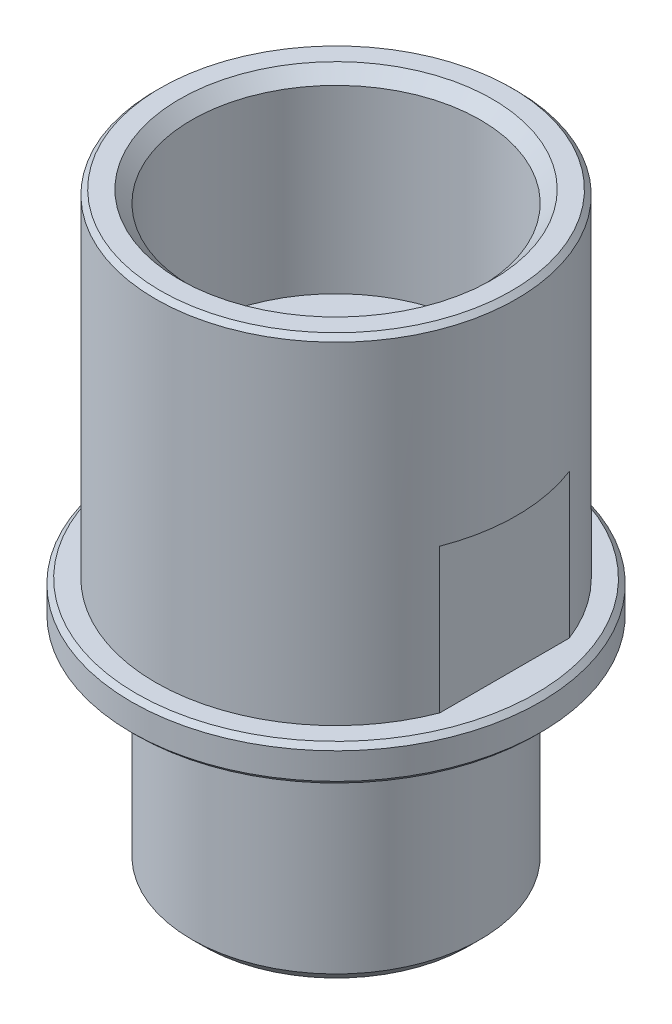
ISO-10303-21;
HEADER;
FILE_DESCRIPTION(('STEP AP214'),'2;1');
FILE_NAME('part.step','',(''),(''),'','','');
FILE_SCHEMA(('AUTOMOTIVE_DESIGN { 1 0 10303 214 1 1 1 1 }'));
ENDSEC;
DATA;
#1=APPLICATION_CONTEXT('core data for automotive mechanical design processes');
#2=APPLICATION_PROTOCOL_DEFINITION('international standard','automotive_design',2000,#1);
#3=PRODUCT_CONTEXT('',#1,'mechanical');
#4=PRODUCT('Part','Part','',(#3));
#5=PRODUCT_RELATED_PRODUCT_CATEGORY('part','',(#4));
#6=PRODUCT_DEFINITION_FORMATION('','',#4);
#7=PRODUCT_DEFINITION_CONTEXT('part definition',#1,'design');
#8=PRODUCT_DEFINITION('design','',#6,#7);
#9=PRODUCT_DEFINITION_SHAPE('','',#8);
#10=(LENGTH_UNIT() NAMED_UNIT(*) SI_UNIT(.MILLI.,.METRE.));
#11=(NAMED_UNIT(*) PLANE_ANGLE_UNIT() SI_UNIT($,.RADIAN.));
#12=(NAMED_UNIT(*) SI_UNIT($,.STERADIAN.) SOLID_ANGLE_UNIT());
#13=UNCERTAINTY_MEASURE_WITH_UNIT(LENGTH_MEASURE(1.E-05),#10,'distance_accuracy_value','');
#14=(GEOMETRIC_REPRESENTATION_CONTEXT(3) GLOBAL_UNCERTAINTY_ASSIGNED_CONTEXT((#13)) GLOBAL_UNIT_ASSIGNED_CONTEXT((#10,
#11,#12)) REPRESENTATION_CONTEXT('',''));
#15=CARTESIAN_POINT('',(0.,0.,0.));
#16=DIRECTION('',(0.,0.,1.));
#17=DIRECTION('',(1.,0.,0.));
#18=AXIS2_PLACEMENT_3D('',#15,#16,#17);
#19=CARTESIAN_POINT('',(0.,15.5,0.));
#20=DIRECTION('',(0.,-1.,0.));
#21=DIRECTION('',(0.,0.,-1.));
#22=AXIS2_PLACEMENT_3D('',#19,#20,#21);
#23=CYLINDRICAL_SURFACE('',#22,4.65);
#24=CARTESIAN_POINT('',(0.,-9.,0.));
#25=DIRECTION('',(0.,-1.,0.));
#26=DIRECTION('',(0.,0.,-1.));
#27=AXIS2_PLACEMENT_3D('',#24,#25,#26);
#28=CIRCLE('',#27,4.65);
#29=CARTESIAN_POINT('',(0.,-9.,-4.65));
#30=VERTEX_POINT('',#29);
#31=EDGE_CURVE('E150',#30,#30,#28,.T.);
#32=ORIENTED_EDGE('',*,*,#31,.T.);
#33=EDGE_LOOP('',(#32));
#34=FACE_BOUND('',#33,.T.);
#35=CARTESIAN_POINT('',(0.,7.5,0.));
#36=DIRECTION('',(0.,1.,0.));
#37=DIRECTION('',(0.,0.,1.));
#38=AXIS2_PLACEMENT_3D('',#35,#36,#37);
#39=CIRCLE('',#38,4.65);
#40=CARTESIAN_POINT('',(0.,7.5,4.65));
#41=VERTEX_POINT('',#40);
#42=EDGE_CURVE('E146',#41,#41,#39,.F.);
#43=ORIENTED_EDGE('',*,*,#42,.F.);
#44=EDGE_LOOP('',(#43));
#45=FACE_BOUND('',#44,.T.);
#46=ADVANCED_FACE('F60',(#34,#45),#23,.F.);
#47=CARTESIAN_POINT('',(0.,1.5,0.));
#48=DIRECTION('',(0.,1.,0.));
#49=DIRECTION('',(0.,0.,1.));
#50=AXIS2_PLACEMENT_3D('',#47,#48,#49);
#51=CYLINDRICAL_SURFACE('',#50,7.5);
#52=CARTESIAN_POINT('',(0.,15.3,0.));
#53=DIRECTION('',(0.,1.,0.));
#54=DIRECTION('',(0.,0.,1.));
#55=AXIS2_PLACEMENT_3D('',#52,#53,#54);
#56=CIRCLE('',#55,7.5);
#57=CARTESIAN_POINT('',(0.,15.3,7.5));
#58=VERTEX_POINT('',#57);
#59=EDGE_CURVE('E156',#58,#58,#56,.F.);
#60=ORIENTED_EDGE('',*,*,#59,.T.);
#61=EDGE_LOOP('',(#60));
#62=FACE_BOUND('',#61,.T.);
#63=DIRECTION('',(0.,1.,0.));
#64=VECTOR('',#63,1.);
#65=CARTESIAN_POINT('',(-7.,1.5,-2.69258240356725));
#66=LINE('',#65,#64);
#67=CARTESIAN_POINT('',(-7.,7.5,-2.69258240356725));
#68=VERTEX_POINT('',#67);
#69=CARTESIAN_POINT('',(-7.,1.5,-2.69258240356725));
#70=VERTEX_POINT('',#69);
#71=EDGE_CURVE('E104',#68,#70,#66,.F.);
#72=ORIENTED_EDGE('',*,*,#71,.F.);
#73=CARTESIAN_POINT('',(0.,7.5,0.));
#74=DIRECTION('',(0.,-1.,0.));
#75=DIRECTION('',(0.,0.,-1.));
#76=AXIS2_PLACEMENT_3D('',#73,#74,#75);
#77=CIRCLE('',#76,7.5);
#78=CARTESIAN_POINT('',(-7.,7.5,2.69258240356725));
#79=VERTEX_POINT('',#78);
#80=EDGE_CURVE('E141',#68,#79,#77,.F.);
#81=ORIENTED_EDGE('',*,*,#80,.T.);
#82=DIRECTION('',(0.,1.,0.));
#83=VECTOR('',#82,1.);
#84=CARTESIAN_POINT('',(-7.,1.5,2.69258240356725));
#85=LINE('',#84,#83);
#86=CARTESIAN_POINT('',(-7.,1.5,2.69258240356725));
#87=VERTEX_POINT('',#86);
#88=EDGE_CURVE('E113',#87,#79,#85,.T.);
#89=ORIENTED_EDGE('',*,*,#88,.F.);
#90=CARTESIAN_POINT('',(0.,1.5,0.));
#91=DIRECTION('',(0.,1.,0.));
#92=DIRECTION('',(0.,0.,1.));
#93=AXIS2_PLACEMENT_3D('',#90,#91,#92);
#94=CIRCLE('',#93,7.5);
#95=CARTESIAN_POINT('',(7.,1.5,2.69258240356725));
#96=VERTEX_POINT('',#95);
#97=EDGE_CURVE('E120',#87,#96,#94,.T.);
#98=ORIENTED_EDGE('',*,*,#97,.T.);
#99=DIRECTION('',(0.,1.,0.));
#100=VECTOR('',#99,1.);
#101=CARTESIAN_POINT('',(7.,1.5,2.69258240356725));
#102=LINE('',#101,#100);
#103=CARTESIAN_POINT('',(7.,7.5,2.69258240356725));
#104=VERTEX_POINT('',#103);
#105=EDGE_CURVE('E131',#104,#96,#102,.F.);
#106=ORIENTED_EDGE('',*,*,#105,.F.);
#107=CARTESIAN_POINT('',(0.,7.5,0.));
#108=DIRECTION('',(0.,1.,0.));
#109=DIRECTION('',(0.,0.,1.));
#110=AXIS2_PLACEMENT_3D('',#107,#108,#109);
#111=CIRCLE('',#110,7.5);
#112=CARTESIAN_POINT('',(7.,7.5,-2.69258240356725));
#113=VERTEX_POINT('',#112);
#114=EDGE_CURVE('E126',#113,#104,#111,.F.);
#115=ORIENTED_EDGE('',*,*,#114,.F.);
#116=DIRECTION('',(0.,1.,0.));
#117=VECTOR('',#116,1.);
#118=CARTESIAN_POINT('',(7.,1.5,-2.69258240356725));
#119=LINE('',#118,#117);
#120=CARTESIAN_POINT('',(7.,1.5,-2.69258240356725));
#121=VERTEX_POINT('',#120);
#122=EDGE_CURVE('E124',#121,#113,#119,.T.);
#123=ORIENTED_EDGE('',*,*,#122,.F.);
#124=EDGE_CURVE('E119',#121,#70,#94,.T.);
#125=ORIENTED_EDGE('',*,*,#124,.T.);
#126=EDGE_LOOP('',(#72,#81,#89,#98,#106,#115,#123,#125));
#127=FACE_BOUND('',#126,.T.);
#128=ADVANCED_FACE('F123',(#62,#127),#51,.T.);
#129=CARTESIAN_POINT('',(0.,15.5,0.));
#130=DIRECTION('',(0.,-1.,0.));
#131=DIRECTION('',(0.,0.,-1.));
#132=AXIS2_PLACEMENT_3D('',#129,#130,#131);
#133=CYLINDRICAL_SURFACE('',#132,8.5);
#134=CARTESIAN_POINT('',(0.,0.199999999999997,0.));
#135=DIRECTION('',(0.,1.,0.));
#136=DIRECTION('',(0.,0.,1.));
#137=AXIS2_PLACEMENT_3D('',#134,#135,#136);
#138=CIRCLE('',#137,8.5);
#139=CARTESIAN_POINT('',(0.,0.199999999999997,8.5));
#140=VERTEX_POINT('',#139);
#141=EDGE_CURVE('E164',#140,#140,#138,.T.);
#142=ORIENTED_EDGE('',*,*,#141,.T.);
#143=EDGE_LOOP('',(#142));
#144=FACE_BOUND('',#143,.T.);
#145=CARTESIAN_POINT('',(0.,1.3,0.));
#146=DIRECTION('',(0.,1.,0.));
#147=DIRECTION('',(0.,0.,1.));
#148=AXIS2_PLACEMENT_3D('',#145,#146,#147);
#149=CIRCLE('',#148,8.5);
#150=CARTESIAN_POINT('',(0.,1.3,8.5));
#151=VERTEX_POINT('',#150);
#152=EDGE_CURVE('E160',#151,#151,#149,.F.);
#153=ORIENTED_EDGE('',*,*,#152,.T.);
#154=EDGE_LOOP('',(#153));
#155=FACE_BOUND('',#154,.T.);
#156=ADVANCED_FACE('F206',(#144,#155),#133,.T.);
#157=CARTESIAN_POINT('',(0.,0.,0.));
#158=DIRECTION('',(0.,1.,0.));
#159=DIRECTION('',(0.,0.,1.));
#160=AXIS2_PLACEMENT_3D('',#157,#158,#159);
#161=PLANE('',#160);
#162=CARTESIAN_POINT('',(0.,0.,0.));
#163=DIRECTION('',(0.,1.,0.));
#164=DIRECTION('',(0.,0.,1.));
#165=AXIS2_PLACEMENT_3D('',#162,#163,#164);
#166=CIRCLE('',#165,8.3);
#167=CARTESIAN_POINT('',(0.,0.,8.3));
#168=VERTEX_POINT('',#167);
#169=EDGE_CURVE('E168',#168,#168,#166,.F.);
#170=ORIENTED_EDGE('',*,*,#169,.T.);
#171=EDGE_LOOP('',(#170));
#172=FACE_BOUND('',#171,.T.);
#173=CARTESIAN_POINT('',(0.,0.,0.));
#174=DIRECTION('',(0.,-1.,0.));
#175=DIRECTION('',(0.,0.,-1.));
#176=AXIS2_PLACEMENT_3D('',#173,#174,#175);
#177=CIRCLE('',#176,6.);
#178=CARTESIAN_POINT('',(0.,0.,-6.));
#179=VERTEX_POINT('',#178);
#180=EDGE_CURVE('E112',#179,#179,#177,.T.);
#181=ORIENTED_EDGE('',*,*,#180,.F.);
#182=EDGE_LOOP('',(#181));
#183=FACE_BOUND('',#182,.T.);
#184=ADVANCED_FACE('F239',(#172,#183),#161,.F.);
#185=CARTESIAN_POINT('',(0.,1.5,0.));
#186=DIRECTION('',(0.,1.,0.));
#187=DIRECTION('',(0.,0.,1.));
#188=AXIS2_PLACEMENT_3D('',#185,#186,#187);
#189=PLANE('',#188);
#190=CARTESIAN_POINT('',(0.,1.5,0.));
#191=DIRECTION('',(0.,1.,0.));
#192=DIRECTION('',(0.,0.,1.));
#193=AXIS2_PLACEMENT_3D('',#190,#191,#192);
#194=CIRCLE('',#193,8.3);
#195=CARTESIAN_POINT('',(0.,1.5,8.3));
#196=VERTEX_POINT('',#195);
#197=EDGE_CURVE('E172',#196,#196,#194,.T.);
#198=ORIENTED_EDGE('',*,*,#197,.T.);
#199=EDGE_LOOP('',(#198));
#200=FACE_BOUND('',#199,.T.);
#201=ORIENTED_EDGE('',*,*,#97,.F.);
#202=DIRECTION('',(0.,0.,-1.));
#203=VECTOR('',#202,1.);
#204=CARTESIAN_POINT('',(-7.,1.5,7.5));
#205=LINE('',#204,#203);
#206=EDGE_CURVE('E77',#87,#70,#205,.T.);
#207=ORIENTED_EDGE('',*,*,#206,.T.);
#208=ORIENTED_EDGE('',*,*,#124,.F.);
#209=DIRECTION('',(0.,0.,-1.));
#210=VECTOR('',#209,1.);
#211=CARTESIAN_POINT('',(7.,1.5,7.5));
#212=LINE('',#211,#210);
#213=EDGE_CURVE('E85',#96,#121,#212,.T.);
#214=ORIENTED_EDGE('',*,*,#213,.F.);
#215=EDGE_LOOP('',(#201,#207,#208,#214));
#216=FACE_BOUND('',#215,.T.);
#217=ADVANCED_FACE('F118',(#200,#216),#189,.T.);
#218=CARTESIAN_POINT('',(0.,15.5,0.));
#219=DIRECTION('',(0.,1.,0.));
#220=DIRECTION('',(0.,0.,1.));
#221=AXIS2_PLACEMENT_3D('',#218,#219,#220);
#222=PLANE('',#221);
#223=CARTESIAN_POINT('',(0.,15.5,0.));
#224=DIRECTION('',(0.,1.,0.));
#225=DIRECTION('',(0.,0.,1.));
#226=AXIS2_PLACEMENT_3D('',#223,#224,#225);
#227=CIRCLE('',#226,6.50000000000001);
#228=CARTESIAN_POINT('',(0.,15.5,6.50000000000001));
#229=VERTEX_POINT('',#228);
#230=EDGE_CURVE('E13',#229,#229,#227,.F.);
#231=ORIENTED_EDGE('',*,*,#230,.T.);
#232=EDGE_LOOP('',(#231));
#233=FACE_BOUND('',#232,.T.);
#234=CARTESIAN_POINT('',(0.,15.5,0.));
#235=DIRECTION('',(0.,1.,0.));
#236=DIRECTION('',(0.,0.,1.));
#237=AXIS2_PLACEMENT_3D('',#234,#235,#236);
#238=CIRCLE('',#237,7.3);
#239=CARTESIAN_POINT('',(0.,15.5,7.3));
#240=VERTEX_POINT('',#239);
#241=EDGE_CURVE('E152',#240,#240,#238,.T.);
#242=ORIENTED_EDGE('',*,*,#241,.T.);
#243=EDGE_LOOP('',(#242));
#244=FACE_BOUND('',#243,.T.);
#245=ADVANCED_FACE('F234',(#233,#244),#222,.T.);
#246=CARTESIAN_POINT('',(7.,7.5,7.5));
#247=DIRECTION('',(0.,1.,0.));
#248=DIRECTION('',(0.,0.,1.));
#249=AXIS2_PLACEMENT_3D('',#246,#247,#248);
#250=PLANE('',#249);
#251=DIRECTION('',(0.,0.,1.));
#252=VECTOR('',#251,1.);
#253=CARTESIAN_POINT('',(7.,7.5,7.5));
#254=LINE('',#253,#252);
#255=EDGE_CURVE('E133',#113,#104,#254,.T.);
#256=ORIENTED_EDGE('',*,*,#255,.F.);
#257=ORIENTED_EDGE('',*,*,#114,.T.);
#258=EDGE_LOOP('',(#256,#257));
#259=FACE_BOUND('',#258,.T.);
#260=ADVANCED_FACE('F232',(#259),#250,.F.);
#261=CARTESIAN_POINT('',(7.,0.,0.));
#262=DIRECTION('',(-1.,0.,0.));
#263=DIRECTION('',(0.,0.,1.));
#264=AXIS2_PLACEMENT_3D('',#261,#262,#263);
#265=PLANE('',#264);
#266=ORIENTED_EDGE('',*,*,#105,.T.);
#267=ORIENTED_EDGE('',*,*,#213,.T.);
#268=ORIENTED_EDGE('',*,*,#122,.T.);
#269=ORIENTED_EDGE('',*,*,#255,.T.);
#270=EDGE_LOOP('',(#266,#267,#268,#269));
#271=FACE_BOUND('',#270,.T.);
#272=ADVANCED_FACE('F228',(#271),#265,.F.);
#273=CARTESIAN_POINT('',(-7.,7.5,7.5));
#274=DIRECTION('',(0.,-1.,0.));
#275=DIRECTION('',(0.,0.,-1.));
#276=AXIS2_PLACEMENT_3D('',#273,#274,#275);
#277=PLANE('',#276);
#278=DIRECTION('',(0.,0.,1.));
#279=VECTOR('',#278,1.);
#280=CARTESIAN_POINT('',(-7.,7.5,7.5));
#281=LINE('',#280,#279);
#282=EDGE_CURVE('E107',#68,#79,#281,.T.);
#283=ORIENTED_EDGE('',*,*,#282,.T.);
#284=ORIENTED_EDGE('',*,*,#80,.F.);
#285=EDGE_LOOP('',(#283,#284));
#286=FACE_BOUND('',#285,.T.);
#287=ADVANCED_FACE('F225',(#286),#277,.T.);
#288=CARTESIAN_POINT('',(-7.,0.,0.));
#289=DIRECTION('',(1.,0.,0.));
#290=DIRECTION('',(0.,0.,1.));
#291=AXIS2_PLACEMENT_3D('',#288,#289,#290);
#292=PLANE('',#291);
#293=ORIENTED_EDGE('',*,*,#71,.T.);
#294=ORIENTED_EDGE('',*,*,#206,.F.);
#295=ORIENTED_EDGE('',*,*,#88,.T.);
#296=ORIENTED_EDGE('',*,*,#282,.F.);
#297=EDGE_LOOP('',(#293,#294,#295,#296));
#298=FACE_BOUND('',#297,.T.);
#299=ADVANCED_FACE('F105',(#298),#292,.F.);
#300=CARTESIAN_POINT('',(0.,-9.,0.));
#301=DIRECTION('',(0.,1.,0.));
#302=DIRECTION('',(0.,0.,1.));
#303=AXIS2_PLACEMENT_3D('',#300,#301,#302);
#304=CYLINDRICAL_SURFACE('',#303,6.);
#305=CARTESIAN_POINT('',(0.,-8.49999999999999,0.));
#306=DIRECTION('',(0.,-1.,0.));
#307=DIRECTION('',(0.,0.,-1.));
#308=AXIS2_PLACEMENT_3D('',#305,#306,#307);
#309=CIRCLE('',#308,6.);
#310=CARTESIAN_POINT('',(0.,-8.49999999999999,-6.));
#311=VERTEX_POINT('',#310);
#312=EDGE_CURVE('E180',#311,#311,#309,.F.);
#313=ORIENTED_EDGE('',*,*,#312,.T.);
#314=EDGE_LOOP('',(#313));
#315=FACE_BOUND('',#314,.T.);
#316=ORIENTED_EDGE('',*,*,#180,.T.);
#317=EDGE_LOOP('',(#316));
#318=FACE_BOUND('',#317,.T.);
#319=ADVANCED_FACE('F218',(#315,#318),#304,.T.);
#320=CARTESIAN_POINT('',(0.,-9.,0.));
#321=DIRECTION('',(0.,-1.,0.));
#322=DIRECTION('',(0.,0.,-1.));
#323=AXIS2_PLACEMENT_3D('',#320,#321,#322);
#324=PLANE('',#323);
#325=CARTESIAN_POINT('',(0.,-9.,0.));
#326=DIRECTION('',(0.,-1.,0.));
#327=DIRECTION('',(0.,0.,-1.));
#328=AXIS2_PLACEMENT_3D('',#325,#326,#327);
#329=CIRCLE('',#328,5.49999999999999);
#330=CARTESIAN_POINT('',(0.,-9.,-5.49999999999999));
#331=VERTEX_POINT('',#330);
#332=EDGE_CURVE('E176',#331,#331,#329,.T.);
#333=ORIENTED_EDGE('',*,*,#332,.T.);
#334=EDGE_LOOP('',(#333));
#335=FACE_BOUND('',#334,.T.);
#336=ORIENTED_EDGE('',*,*,#31,.F.);
#337=EDGE_LOOP('',(#336));
#338=FACE_BOUND('',#337,.T.);
#339=ADVANCED_FACE('F214',(#335,#338),#324,.T.);
#340=CARTESIAN_POINT('',(0.,7.5,0.));
#341=DIRECTION('',(0.,1.,0.));
#342=DIRECTION('',(0.,0.,1.));
#343=AXIS2_PLACEMENT_3D('',#340,#341,#342);
#344=PLANE('',#343);
#345=CARTESIAN_POINT('',(0.,7.5,0.));
#346=DIRECTION('',(0.,1.,0.));
#347=DIRECTION('',(0.,0.,1.));
#348=AXIS2_PLACEMENT_3D('',#345,#346,#347);
#349=CIRCLE('',#348,6.);
#350=CARTESIAN_POINT('',(0.,7.5,6.));
#351=VERTEX_POINT('',#350);
#352=EDGE_CURVE('E151',#351,#351,#349,.T.);
#353=ORIENTED_EDGE('',*,*,#352,.T.);
#354=EDGE_LOOP('',(#353));
#355=FACE_BOUND('',#354,.T.);
#356=ORIENTED_EDGE('',*,*,#42,.T.);
#357=EDGE_LOOP('',(#356));
#358=FACE_BOUND('',#357,.T.);
#359=ADVANCED_FACE('F217',(#355,#358),#344,.T.);
#360=CARTESIAN_POINT('',(0.,7.5,0.));
#361=DIRECTION('',(0.,1.,0.));
#362=DIRECTION('',(0.,0.,1.));
#363=AXIS2_PLACEMENT_3D('',#360,#361,#362);
#364=CYLINDRICAL_SURFACE('',#363,6.);
#365=CARTESIAN_POINT('',(0.,15.,0.));
#366=DIRECTION('',(0.,1.,0.));
#367=DIRECTION('',(0.,0.,1.));
#368=AXIS2_PLACEMENT_3D('',#365,#366,#367);
#369=CIRCLE('',#368,6.);
#370=CARTESIAN_POINT('',(0.,15.,6.));
#371=VERTEX_POINT('',#370);
#372=EDGE_CURVE('E70',#371,#371,#369,.T.);
#373=ORIENTED_EDGE('',*,*,#372,.T.);
#374=EDGE_LOOP('',(#373));
#375=FACE_BOUND('',#374,.T.);
#376=ORIENTED_EDGE('',*,*,#352,.F.);
#377=EDGE_LOOP('',(#376));
#378=FACE_BOUND('',#377,.T.);
#379=ADVANCED_FACE('F188',(#375,#378),#364,.F.);
#380=CARTESIAN_POINT('',(0.,15.5,0.));
#381=DIRECTION('',(0.,-1.,0.));
#382=DIRECTION('',(0.,0.,-1.));
#383=AXIS2_PLACEMENT_3D('',#380,#381,#382);
#384=CONICAL_SURFACE('',#383,7.3,0.785398163397448);
#385=ORIENTED_EDGE('',*,*,#59,.F.);
#386=EDGE_LOOP('',(#385));
#387=FACE_BOUND('',#386,.T.);
#388=ORIENTED_EDGE('',*,*,#241,.F.);
#389=EDGE_LOOP('',(#388));
#390=FACE_BOUND('',#389,.T.);
#391=ADVANCED_FACE('F251',(#387,#390),#384,.T.);
#392=CARTESIAN_POINT('',(0.,0.199999999999997,0.));
#393=DIRECTION('',(0.,1.,0.));
#394=DIRECTION('',(0.,0.,1.));
#395=AXIS2_PLACEMENT_3D('',#392,#393,#394);
#396=CONICAL_SURFACE('',#395,8.5,0.785398163397453);
#397=ORIENTED_EDGE('',*,*,#169,.F.);
#398=EDGE_LOOP('',(#397));
#399=FACE_BOUND('',#398,.T.);
#400=ORIENTED_EDGE('',*,*,#141,.F.);
#401=EDGE_LOOP('',(#400));
#402=FACE_BOUND('',#401,.T.);
#403=ADVANCED_FACE('F257',(#399,#402),#396,.T.);
#404=CARTESIAN_POINT('',(0.,1.5,0.));
#405=DIRECTION('',(0.,-1.,0.));
#406=DIRECTION('',(0.,0.,-1.));
#407=AXIS2_PLACEMENT_3D('',#404,#405,#406);
#408=CONICAL_SURFACE('',#407,8.3,0.785398163397461);
#409=ORIENTED_EDGE('',*,*,#152,.F.);
#410=EDGE_LOOP('',(#409));
#411=FACE_BOUND('',#410,.T.);
#412=ORIENTED_EDGE('',*,*,#197,.F.);
#413=EDGE_LOOP('',(#412));
#414=FACE_BOUND('',#413,.T.);
#415=ADVANCED_FACE('F197',(#411,#414),#408,.T.);
#416=CARTESIAN_POINT('',(0.,-9.,0.));
#417=DIRECTION('',(0.,1.,0.));
#418=DIRECTION('',(0.,0.,1.));
#419=AXIS2_PLACEMENT_3D('',#416,#417,#418);
#420=CONICAL_SURFACE('',#419,5.49999999999999,0.785398163397448);
#421=ORIENTED_EDGE('',*,*,#312,.F.);
#422=EDGE_LOOP('',(#421));
#423=FACE_BOUND('',#422,.T.);
#424=ORIENTED_EDGE('',*,*,#332,.F.);
#425=EDGE_LOOP('',(#424));
#426=FACE_BOUND('',#425,.T.);
#427=ADVANCED_FACE('F192',(#423,#426),#420,.T.);
#428=CARTESIAN_POINT('',(0.,15.,0.));
#429=DIRECTION('',(0.,1.,0.));
#430=DIRECTION('',(0.,0.,1.));
#431=AXIS2_PLACEMENT_3D('',#428,#429,#430);
#432=CONICAL_SURFACE('',#431,6.,0.785398163397448);
#433=ORIENTED_EDGE('',*,*,#230,.F.);
#434=EDGE_LOOP('',(#433));
#435=FACE_BOUND('',#434,.T.);
#436=ORIENTED_EDGE('',*,*,#372,.F.);
#437=EDGE_LOOP('',(#436));
#438=FACE_BOUND('',#437,.T.);
#439=ADVANCED_FACE('F63',(#435,#438),#432,.F.);
#440=CLOSED_SHELL('',(#46,#128,#156,#184,#217,#245,#260,#272,#287,#299,#319,#339,#359,#379,#391,
#403,#415,#427,#439));
#441=MANIFOLD_SOLID_BREP('B2',#440);
#442=ADVANCED_BREP_SHAPE_REPRESENTATION('',(#18,#441),#14);
#443=SHAPE_DEFINITION_REPRESENTATION(#9,#442);
ENDSEC;
END-ISO-10303-21;
